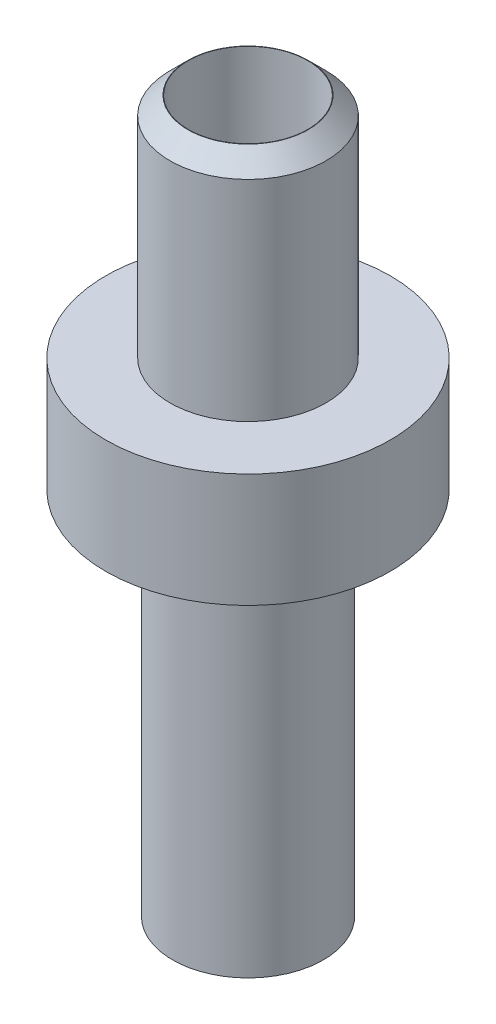
ISO-10303-21;
HEADER;
FILE_DESCRIPTION(('STEP AP214'),'2;1');
FILE_NAME('part.step','',(''),(''),'','','');
FILE_SCHEMA(('AUTOMOTIVE_DESIGN { 1 0 10303 214 1 1 1 1 }'));
ENDSEC;
DATA;
#1=APPLICATION_CONTEXT('core data for automotive mechanical design processes');
#2=APPLICATION_PROTOCOL_DEFINITION('international standard','automotive_design',2000,#1);
#3=PRODUCT_CONTEXT('',#1,'mechanical');
#4=PRODUCT('Part','Part','',(#3));
#5=PRODUCT_RELATED_PRODUCT_CATEGORY('part','',(#4));
#6=PRODUCT_DEFINITION_FORMATION('','',#4);
#7=PRODUCT_DEFINITION_CONTEXT('part definition',#1,'design');
#8=PRODUCT_DEFINITION('design','',#6,#7);
#9=PRODUCT_DEFINITION_SHAPE('','',#8);
#10=(LENGTH_UNIT() NAMED_UNIT(*) SI_UNIT(.MILLI.,.METRE.));
#11=(NAMED_UNIT(*) PLANE_ANGLE_UNIT() SI_UNIT($,.RADIAN.));
#12=(NAMED_UNIT(*) SI_UNIT($,.STERADIAN.) SOLID_ANGLE_UNIT());
#13=UNCERTAINTY_MEASURE_WITH_UNIT(LENGTH_MEASURE(1.E-05),#10,'distance_accuracy_value','');
#14=(GEOMETRIC_REPRESENTATION_CONTEXT(3) GLOBAL_UNCERTAINTY_ASSIGNED_CONTEXT((#13)) GLOBAL_UNIT_ASSIGNED_CONTEXT((#10,
#11,#12)) REPRESENTATION_CONTEXT('',''));
#15=CARTESIAN_POINT('',(0.,0.,0.));
#16=DIRECTION('',(0.,0.,1.));
#17=DIRECTION('',(1.,0.,0.));
#18=AXIS2_PLACEMENT_3D('',#15,#16,#17);
#19=CARTESIAN_POINT('',(-3.15,25.,0.));
#20=DIRECTION('',(0.,-1.,0.));
#21=DIRECTION('',(0.,0.,-1.));
#22=AXIS2_PLACEMENT_3D('',#19,#20,#21);
#23=PLANE('',#22);
#24=CARTESIAN_POINT('',(0.,25.,0.));
#25=DIRECTION('',(0.,1.,0.));
#26=DIRECTION('',(0.,0.,1.));
#27=AXIS2_PLACEMENT_3D('',#24,#25,#26);
#28=CIRCLE('',#27,2.09891333071118);
#29=CARTESIAN_POINT('',(0.,25.,2.09891333071118));
#30=VERTEX_POINT('',#29);
#31=EDGE_CURVE('E75',#30,#30,#28,.T.);
#32=ORIENTED_EDGE('',*,*,#31,.F.);
#33=EDGE_LOOP('',(#32));
#34=FACE_BOUND('',#33,.T.);
#35=CARTESIAN_POINT('',(0.,25.,0.));
#36=DIRECTION('',(0.,-1.,0.));
#37=DIRECTION('',(0.,0.,-1.));
#38=AXIS2_PLACEMENT_3D('',#35,#36,#37);
#39=CIRCLE('',#38,2.11328);
#40=CARTESIAN_POINT('',(0.,25.,-2.11328));
#41=VERTEX_POINT('',#40);
#42=EDGE_CURVE('E83',#41,#41,#39,.T.);
#43=ORIENTED_EDGE('',*,*,#42,.F.);
#44=EDGE_LOOP('',(#43));
#45=FACE_BOUND('',#44,.T.);
#46=ADVANCED_FACE('F47',(#34,#45),#23,.F.);
#47=CARTESIAN_POINT('',(0.,0.,0.));
#48=DIRECTION('',(0.,1.,0.));
#49=DIRECTION('',(0.,0.,1.));
#50=AXIS2_PLACEMENT_3D('',#47,#48,#49);
#51=PLANE('',#50);
#52=CARTESIAN_POINT('',(0.,0.,0.));
#53=DIRECTION('',(0.,1.,0.));
#54=DIRECTION('',(0.,0.,1.));
#55=AXIS2_PLACEMENT_3D('',#52,#53,#54);
#56=CIRCLE('',#55,2.09891333071118);
#57=CARTESIAN_POINT('',(0.,0.,2.09891333071118));
#58=VERTEX_POINT('',#57);
#59=EDGE_CURVE('E71',#58,#58,#56,.T.);
#60=ORIENTED_EDGE('',*,*,#59,.T.);
#61=EDGE_LOOP('',(#60));
#62=FACE_BOUND('',#61,.T.);
#63=CARTESIAN_POINT('',(0.,0.,0.));
#64=DIRECTION('',(0.,-1.,0.));
#65=DIRECTION('',(0.,0.,-1.));
#66=AXIS2_PLACEMENT_3D('',#63,#64,#65);
#67=CIRCLE('',#66,2.65);
#68=CARTESIAN_POINT('',(0.,0.,-2.65));
#69=VERTEX_POINT('',#68);
#70=EDGE_CURVE('E10',#69,#69,#67,.T.);
#71=ORIENTED_EDGE('',*,*,#70,.T.);
#72=EDGE_LOOP('',(#71));
#73=FACE_BOUND('',#72,.T.);
#74=ADVANCED_FACE('F49',(#62,#73),#51,.F.);
#75=CARTESIAN_POINT('',(0.,0.,0.));
#76=DIRECTION('',(0.,-1.,0.));
#77=DIRECTION('',(0.,0.,-1.));
#78=AXIS2_PLACEMENT_3D('',#75,#76,#77);
#79=CYLINDRICAL_SURFACE('',#78,2.65);
#80=ORIENTED_EDGE('',*,*,#70,.F.);
#81=EDGE_LOOP('',(#80));
#82=FACE_BOUND('',#81,.T.);
#83=CARTESIAN_POINT('',(0.,13.,0.));
#84=DIRECTION('',(0.,-1.,0.));
#85=DIRECTION('',(0.,0.,-1.));
#86=AXIS2_PLACEMENT_3D('',#83,#84,#85);
#87=CIRCLE('',#86,2.65);
#88=CARTESIAN_POINT('',(0.,13.,-2.65));
#89=VERTEX_POINT('',#88);
#90=EDGE_CURVE('E55',#89,#89,#87,.T.);
#91=ORIENTED_EDGE('',*,*,#90,.T.);
#92=EDGE_LOOP('',(#91));
#93=FACE_BOUND('',#92,.T.);
#94=ADVANCED_FACE('F108',(#82,#93),#79,.T.);
#95=CARTESIAN_POINT('',(-2.65,13.,0.));
#96=DIRECTION('',(0.,1.,0.));
#97=DIRECTION('',(0.,0.,1.));
#98=AXIS2_PLACEMENT_3D('',#95,#96,#97);
#99=PLANE('',#98);
#100=ORIENTED_EDGE('',*,*,#90,.F.);
#101=EDGE_LOOP('',(#100));
#102=FACE_BOUND('',#101,.T.);
#103=CARTESIAN_POINT('',(0.,13.,0.));
#104=DIRECTION('',(0.,-1.,0.));
#105=DIRECTION('',(0.,0.,-1.));
#106=AXIS2_PLACEMENT_3D('',#103,#104,#105);
#107=CIRCLE('',#106,5.);
#108=CARTESIAN_POINT('',(0.,13.,-5.));
#109=VERTEX_POINT('',#108);
#110=EDGE_CURVE('E60',#109,#109,#107,.T.);
#111=ORIENTED_EDGE('',*,*,#110,.T.);
#112=EDGE_LOOP('',(#111));
#113=FACE_BOUND('',#112,.T.);
#114=ADVANCED_FACE('F121',(#102,#113),#99,.F.);
#115=CARTESIAN_POINT('',(0.,0.,0.));
#116=DIRECTION('',(0.,-1.,0.));
#117=DIRECTION('',(0.,0.,-1.));
#118=AXIS2_PLACEMENT_3D('',#115,#116,#117);
#119=CYLINDRICAL_SURFACE('',#118,5.);
#120=ORIENTED_EDGE('',*,*,#110,.F.);
#121=EDGE_LOOP('',(#120));
#122=FACE_BOUND('',#121,.T.);
#123=CARTESIAN_POINT('',(0.,17.,0.));
#124=DIRECTION('',(0.,-1.,0.));
#125=DIRECTION('',(0.,0.,-1.));
#126=AXIS2_PLACEMENT_3D('',#123,#124,#125);
#127=CIRCLE('',#126,5.);
#128=CARTESIAN_POINT('',(0.,17.,-5.));
#129=VERTEX_POINT('',#128);
#130=EDGE_CURVE('E65',#129,#129,#127,.T.);
#131=ORIENTED_EDGE('',*,*,#130,.T.);
#132=EDGE_LOOP('',(#131));
#133=FACE_BOUND('',#132,.T.);
#134=ADVANCED_FACE('F117',(#122,#133),#119,.T.);
#135=CARTESIAN_POINT('',(-5.,17.,0.));
#136=DIRECTION('',(0.,-1.,0.));
#137=DIRECTION('',(0.,0.,-1.));
#138=AXIS2_PLACEMENT_3D('',#135,#136,#137);
#139=PLANE('',#138);
#140=ORIENTED_EDGE('',*,*,#130,.F.);
#141=EDGE_LOOP('',(#140));
#142=FACE_BOUND('',#141,.T.);
#143=CARTESIAN_POINT('',(0.,17.,0.));
#144=DIRECTION('',(0.,-1.,0.));
#145=DIRECTION('',(0.,0.,-1.));
#146=AXIS2_PLACEMENT_3D('',#143,#144,#145);
#147=CIRCLE('',#146,2.7432);
#148=CARTESIAN_POINT('',(0.,17.,-2.7432));
#149=VERTEX_POINT('',#148);
#150=EDGE_CURVE('E79',#149,#149,#147,.T.);
#151=ORIENTED_EDGE('',*,*,#150,.T.);
#152=EDGE_LOOP('',(#151));
#153=FACE_BOUND('',#152,.T.);
#154=ADVANCED_FACE('F115',(#142,#153),#139,.F.);
#155=CARTESIAN_POINT('',(0.,-35.,0.));
#156=DIRECTION('',(0.,1.,0.));
#157=DIRECTION('',(0.,0.,1.));
#158=AXIS2_PLACEMENT_3D('',#155,#156,#157);
#159=CYLINDRICAL_SURFACE('',#158,2.09891333071118);
#160=CARTESIAN_POINT('',(0.,25.,2.09891333071118));
#161=CARTESIAN_POINT('',(0.,24.7395833333333,2.09891333071118));
#162=CARTESIAN_POINT('',(0.,24.4791666666667,2.09891333071118));
#163=CARTESIAN_POINT('',(0.,23.9583333333333,2.09891333071118));
#164=CARTESIAN_POINT('',(0.,23.6979166666667,2.09891333071118));
#165=CARTESIAN_POINT('',(0.,23.1770833333333,2.09891333071118));
#166=CARTESIAN_POINT('',(0.,22.9166666666667,2.09891333071118));
#167=CARTESIAN_POINT('',(0.,22.3958333333333,2.09891333071118));
#168=CARTESIAN_POINT('',(0.,22.1354166666667,2.09891333071118));
#169=CARTESIAN_POINT('',(0.,21.6145833333333,2.09891333071118));
#170=CARTESIAN_POINT('',(0.,21.3541666666667,2.09891333071118));
#171=CARTESIAN_POINT('',(0.,20.8333333333333,2.09891333071118));
#172=CARTESIAN_POINT('',(0.,20.5729166666667,2.09891333071118));
#173=CARTESIAN_POINT('',(0.,20.0520833333333,2.09891333071118));
#174=CARTESIAN_POINT('',(0.,19.7916666666667,2.09891333071118));
#175=CARTESIAN_POINT('',(0.,19.2708333333333,2.09891333071118));
#176=CARTESIAN_POINT('',(0.,19.0104166666667,2.09891333071118));
#177=CARTESIAN_POINT('',(0.,18.4895833333333,2.09891333071118));
#178=CARTESIAN_POINT('',(0.,18.2291666666667,2.09891333071118));
#179=CARTESIAN_POINT('',(0.,17.7083333333333,2.09891333071118));
#180=CARTESIAN_POINT('',(0.,17.4479166666667,2.09891333071118));
#181=CARTESIAN_POINT('',(0.,16.9270833333333,2.09891333071118));
#182=CARTESIAN_POINT('',(0.,16.6666666666667,2.09891333071118));
#183=CARTESIAN_POINT('',(0.,16.1458333333333,2.09891333071118));
#184=CARTESIAN_POINT('',(0.,15.8854166666667,2.09891333071118));
#185=CARTESIAN_POINT('',(0.,15.3645833333333,2.09891333071118));
#186=CARTESIAN_POINT('',(0.,15.1041666666667,2.09891333071118));
#187=CARTESIAN_POINT('',(0.,14.5833333333333,2.09891333071118));
#188=CARTESIAN_POINT('',(0.,14.3229166666667,2.09891333071118));
#189=CARTESIAN_POINT('',(0.,13.8020833333333,2.09891333071118));
#190=CARTESIAN_POINT('',(0.,13.5416666666667,2.09891333071118));
#191=CARTESIAN_POINT('',(0.,13.0208333333333,2.09891333071118));
#192=CARTESIAN_POINT('',(0.,12.7604166666667,2.09891333071118));
#193=CARTESIAN_POINT('',(0.,12.2395833333333,2.09891333071118));
#194=CARTESIAN_POINT('',(0.,11.9791666666667,2.09891333071118));
#195=CARTESIAN_POINT('',(0.,11.4583333333333,2.09891333071118));
#196=CARTESIAN_POINT('',(0.,11.1979166666667,2.09891333071118));
#197=CARTESIAN_POINT('',(0.,10.6770833333333,2.09891333071118));
#198=CARTESIAN_POINT('',(0.,10.4166666666667,2.09891333071118));
#199=CARTESIAN_POINT('',(0.,9.89583333333333,2.09891333071118));
#200=CARTESIAN_POINT('',(0.,9.63541666666666,2.09891333071118));
#201=CARTESIAN_POINT('',(0.,9.11458333333333,2.09891333071118));
#202=CARTESIAN_POINT('',(0.,8.85416666666666,2.09891333071118));
#203=CARTESIAN_POINT('',(0.,8.33333333333333,2.09891333071118));
#204=CARTESIAN_POINT('',(0.,8.07291666666666,2.09891333071118));
#205=CARTESIAN_POINT('',(0.,7.55208333333333,2.09891333071118));
#206=CARTESIAN_POINT('',(0.,7.29166666666666,2.09891333071118));
#207=CARTESIAN_POINT('',(0.,6.77083333333333,2.09891333071118));
#208=CARTESIAN_POINT('',(0.,6.51041666666666,2.09891333071118));
#209=CARTESIAN_POINT('',(0.,5.98958333333333,2.09891333071118));
#210=CARTESIAN_POINT('',(0.,5.72916666666666,2.09891333071118));
#211=CARTESIAN_POINT('',(0.,5.20833333333333,2.09891333071118));
#212=CARTESIAN_POINT('',(0.,4.94791666666666,2.09891333071118));
#213=CARTESIAN_POINT('',(0.,4.42708333333332,2.09891333071118));
#214=CARTESIAN_POINT('',(0.,4.16666666666666,2.09891333071118));
#215=CARTESIAN_POINT('',(0.,3.64583333333333,2.09891333071118));
#216=CARTESIAN_POINT('',(0.,3.38541666666666,2.09891333071118));
#217=CARTESIAN_POINT('',(0.,2.86458333333333,2.09891333071118));
#218=CARTESIAN_POINT('',(0.,2.60416666666666,2.09891333071118));
#219=CARTESIAN_POINT('',(0.,2.08333333333333,2.09891333071118));
#220=CARTESIAN_POINT('',(0.,1.82291666666666,2.09891333071118));
#221=CARTESIAN_POINT('',(0.,1.30208333333333,2.09891333071118));
#222=CARTESIAN_POINT('',(0.,1.04166666666666,2.09891333071118));
#223=CARTESIAN_POINT('',(0.,0.520833333333325,2.09891333071118));
#224=CARTESIAN_POINT('',(0.,0.260416666666659,2.09891333071118));
#225=CARTESIAN_POINT('',(0.,0.,2.09891333071118));
#226=B_SPLINE_CURVE_WITH_KNOTS('',3,(#160,#161,#162,#163,#164,#165,#166,#167,#168,#169,#170,
#171,#172,#173,#174,#175,#176,#177,#178,#179,#180,#181,#182,#183,#184,#185,#186,#187,#188,#189,
#190,#191,#192,#193,#194,#195,#196,#197,#198,#199,#200,#201,#202,#203,#204,#205,#206,#207,#208,
#209,#210,#211,#212,#213,#214,#215,#216,#217,#218,#219,#220,#221,#222,#223,#224,#225),
.UNSPECIFIED.,.F.,.F.,(4,2,2,2,2,2,2,2,2,2,2,2,2,2,2,2,2,2,2,2,2,2,2,2,2,2,2,2,2,2,2,2,4),(0.,
0.781249999999997,1.5625,2.34375,3.125,3.90625,4.6875,5.46875,6.25000000000001,7.03125,7.8125,
8.59375,9.375,10.15625,10.9375,11.71875,12.5,13.28125,14.0625,14.84375,15.625,16.40625,17.1875,
17.96875,18.75,19.53125,20.3125,21.09375,21.875,22.65625,23.4375,24.21875,25.),.UNSPECIFIED.);
#227=EDGE_CURVE('BSEAM113',#30,#58,#226,.T.);
#228=ORIENTED_EDGE('',*,*,#31,.T.);
#229=ORIENTED_EDGE('',*,*,#59,.F.);
#230=ORIENTED_EDGE('',*,*,#227,.T.);
#231=ORIENTED_EDGE('',*,*,#227,.F.);
#232=EDGE_LOOP('',(#228,#230,#229,#231));
#233=FACE_BOUND('',#232,.T.);
#234=ADVANCED_FACE('F113',(#233),#159,.F.);
#235=CARTESIAN_POINT('',(0.,25.,0.));
#236=DIRECTION('',(0.,-1.,0.));
#237=DIRECTION('',(0.,0.,-1.));
#238=AXIS2_PLACEMENT_3D('',#235,#236,#237);
#239=CYLINDRICAL_SURFACE('',#238,2.7432);
#240=ORIENTED_EDGE('',*,*,#150,.F.);
#241=EDGE_LOOP('',(#240));
#242=FACE_BOUND('',#241,.T.);
#243=CARTESIAN_POINT('',(0.,24.37008,0.));
#244=DIRECTION('',(0.,-1.,0.));
#245=DIRECTION('',(0.,0.,-1.));
#246=AXIS2_PLACEMENT_3D('',#243,#244,#245);
#247=CIRCLE('',#246,2.7432);
#248=CARTESIAN_POINT('',(0.,24.37008,-2.7432));
#249=VERTEX_POINT('',#248);
#250=EDGE_CURVE('E87',#249,#249,#247,.T.);
#251=ORIENTED_EDGE('',*,*,#250,.T.);
#252=EDGE_LOOP('',(#251));
#253=FACE_BOUND('',#252,.T.);
#254=ADVANCED_FACE('F92',(#242,#253),#239,.T.);
#255=CARTESIAN_POINT('',(0.,25.,0.));
#256=DIRECTION('',(0.,-1.,0.));
#257=DIRECTION('',(0.,0.,-1.));
#258=AXIS2_PLACEMENT_3D('',#255,#256,#257);
#259=CONICAL_SURFACE('',#258,2.11328,0.785398163397452);
#260=ORIENTED_EDGE('',*,*,#250,.F.);
#261=EDGE_LOOP('',(#260));
#262=FACE_BOUND('',#261,.T.);
#263=ORIENTED_EDGE('',*,*,#42,.T.);
#264=EDGE_LOOP('',(#263));
#265=FACE_BOUND('',#264,.T.);
#266=ADVANCED_FACE('F94',(#262,#265),#259,.T.);
#267=CLOSED_SHELL('',(#46,#74,#94,#114,#134,#154,#234,#254,#266));
#268=MANIFOLD_SOLID_BREP('B2',#267);
#269=ADVANCED_BREP_SHAPE_REPRESENTATION('',(#18,#268),#14);
#270=SHAPE_DEFINITION_REPRESENTATION(#9,#269);
ENDSEC;
END-ISO-10303-21;
